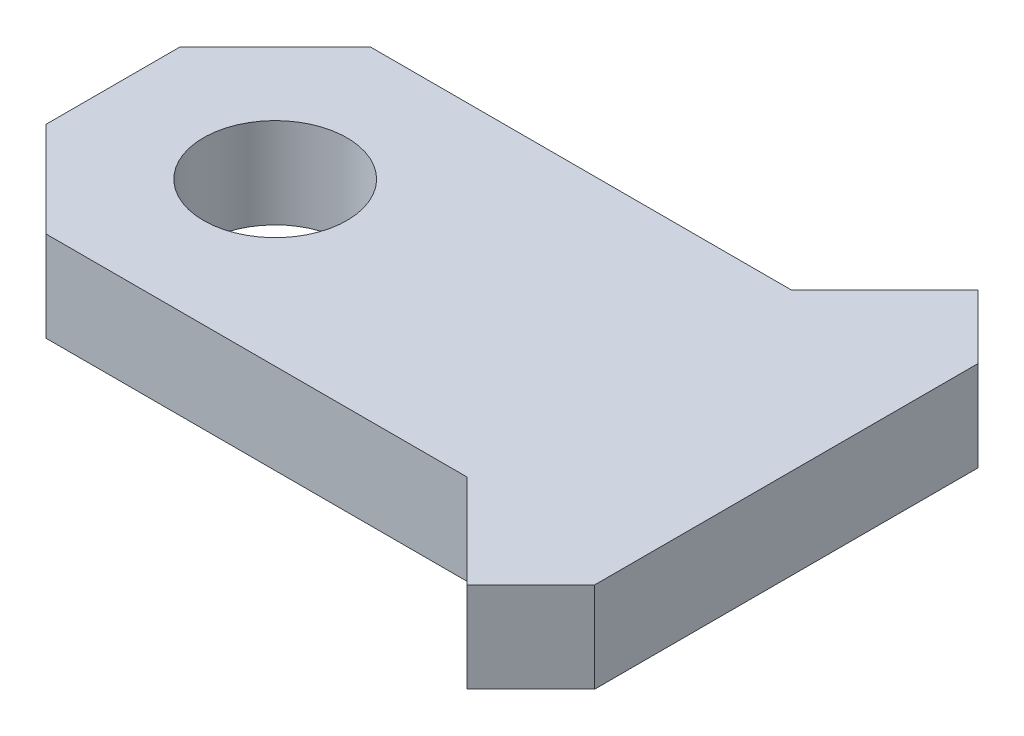
ISO-10303-21;
HEADER;
FILE_DESCRIPTION(('STEP AP214'),'2;1');
FILE_NAME('part.step','',(''),(''),'','','');
FILE_SCHEMA(('AUTOMOTIVE_DESIGN { 1 0 10303 214 1 1 1 1 }'));
ENDSEC;
DATA;
#1=APPLICATION_CONTEXT('core data for automotive mechanical design processes');
#2=APPLICATION_PROTOCOL_DEFINITION('international standard','automotive_design',2000,#1);
#3=PRODUCT_CONTEXT('',#1,'mechanical');
#4=PRODUCT('Part','Part','',(#3));
#5=PRODUCT_RELATED_PRODUCT_CATEGORY('part','',(#4));
#6=PRODUCT_DEFINITION_FORMATION('','',#4);
#7=PRODUCT_DEFINITION_CONTEXT('part definition',#1,'design');
#8=PRODUCT_DEFINITION('design','',#6,#7);
#9=PRODUCT_DEFINITION_SHAPE('','',#8);
#10=(LENGTH_UNIT() NAMED_UNIT(*) SI_UNIT(.MILLI.,.METRE.));
#11=(NAMED_UNIT(*) PLANE_ANGLE_UNIT() SI_UNIT($,.RADIAN.));
#12=(NAMED_UNIT(*) SI_UNIT($,.STERADIAN.) SOLID_ANGLE_UNIT());
#13=UNCERTAINTY_MEASURE_WITH_UNIT(LENGTH_MEASURE(1.E-05),#10,'distance_accuracy_value','');
#14=(GEOMETRIC_REPRESENTATION_CONTEXT(3) GLOBAL_UNCERTAINTY_ASSIGNED_CONTEXT((#13)) GLOBAL_UNIT_ASSIGNED_CONTEXT((#10,
#11,#12)) REPRESENTATION_CONTEXT('',''));
#15=CARTESIAN_POINT('',(0.,0.,0.));
#16=DIRECTION('',(0.,0.,1.));
#17=DIRECTION('',(1.,0.,0.));
#18=AXIS2_PLACEMENT_3D('',#15,#16,#17);
#19=CARTESIAN_POINT('',(0.,4.,0.));
#20=DIRECTION('',(0.,1.,0.));
#21=DIRECTION('',(0.,0.,1.));
#22=AXIS2_PLACEMENT_3D('',#19,#20,#21);
#23=PLANE('',#22);
#24=DIRECTION('',(-0.707106781186544,0.,0.707106781186551));
#25=VECTOR('',#24,1.);
#26=CARTESIAN_POINT('',(-2.97198231002694,4.,-7.17500000000009));
#27=LINE('',#26,#25);
#28=CARTESIAN_POINT('',(-2.97198231002694,4.,-7.17500000000009));
#29=VERTEX_POINT('',#28);
#30=CARTESIAN_POINT('',(-7.175,4.,-2.97198231002698));
#31=VERTEX_POINT('',#30);
#32=EDGE_CURVE('E165',#29,#31,#27,.T.);
#33=ORIENTED_EDGE('',*,*,#32,.T.);
#34=DIRECTION('',(0.,0.,1.));
#35=VECTOR('',#34,1.);
#36=CARTESIAN_POINT('',(-7.175,4.,-2.97198231002698));
#37=LINE('',#36,#35);
#38=CARTESIAN_POINT('',(-7.175,4.,2.97198231002698));
#39=VERTEX_POINT('',#38);
#40=EDGE_CURVE('E103',#31,#39,#37,.T.);
#41=ORIENTED_EDGE('',*,*,#40,.T.);
#42=DIRECTION('',(0.707106781186551,0.,0.707106781186544));
#43=VECTOR('',#42,1.);
#44=CARTESIAN_POINT('',(-7.175,4.,2.97198231002698));
#45=LINE('',#44,#43);
#46=CARTESIAN_POINT('',(-2.97198231002689,4.,7.17500000000004));
#47=VERTEX_POINT('',#46);
#48=EDGE_CURVE('E186',#39,#47,#45,.T.);
#49=ORIENTED_EDGE('',*,*,#48,.T.);
#50=DIRECTION('',(1.,0.,0.));
#51=VECTOR('',#50,1.);
#52=CARTESIAN_POINT('',(-2.97198231002689,4.,7.17500000000004));
#53=LINE('',#52,#51);
#54=CARTESIAN_POINT('',(15.6602813742387,4.,7.17500000000005));
#55=VERTEX_POINT('',#54);
#56=EDGE_CURVE('E205',#47,#55,#53,.T.);
#57=ORIENTED_EDGE('',*,*,#56,.T.);
#58=DIRECTION('',(0.707106781186546,0.,0.70710678118655));
#59=VECTOR('',#58,1.);
#60=CARTESIAN_POINT('',(15.6602813742387,4.,7.17500000000005));
#61=LINE('',#60,#59);
#62=CARTESIAN_POINT('',(19.7989898732234,4.,11.3137084989848));
#63=VERTEX_POINT('',#62);
#64=EDGE_CURVE('E202',#55,#63,#61,.T.);
#65=ORIENTED_EDGE('',*,*,#64,.T.);
#66=DIRECTION('',(0.707106781186551,0.,-0.707106781186544));
#67=VECTOR('',#66,1.);
#68=CARTESIAN_POINT('',(19.7989898732234,4.,11.3137084989848));
#69=LINE('',#68,#67);
#70=CARTESIAN_POINT('',(22.6274169979696,4.,8.48528137423867));
#71=VERTEX_POINT('',#70);
#72=EDGE_CURVE('E204',#63,#71,#69,.T.);
#73=ORIENTED_EDGE('',*,*,#72,.T.);
#74=DIRECTION('',(0.,0.,-1.));
#75=VECTOR('',#74,1.);
#76=CARTESIAN_POINT('',(22.6274169979696,4.,-8.4852813742386));
#77=LINE('',#76,#75);
#78=CARTESIAN_POINT('',(22.6274169979696,4.,-8.4852813742386));
#79=VERTEX_POINT('',#78);
#80=EDGE_CURVE('E128',#71,#79,#77,.T.);
#81=ORIENTED_EDGE('',*,*,#80,.T.);
#82=DIRECTION('',(-0.707106781186544,0.,-0.707106781186551));
#83=VECTOR('',#82,1.);
#84=CARTESIAN_POINT('',(22.6274169979696,4.,-8.4852813742386));
#85=LINE('',#84,#83);
#86=CARTESIAN_POINT('',(19.7989898732234,4.,-11.3137084989848));
#87=VERTEX_POINT('',#86);
#88=EDGE_CURVE('E122',#79,#87,#85,.T.);
#89=ORIENTED_EDGE('',*,*,#88,.T.);
#90=DIRECTION('',(-0.707106781186555,0.,0.70710678118654));
#91=VECTOR('',#90,1.);
#92=CARTESIAN_POINT('',(19.7989898732234,4.,-11.3137084989848));
#93=LINE('',#92,#91);
#94=CARTESIAN_POINT('',(15.6602813742386,4.,-7.17500000000009));
#95=VERTEX_POINT('',#94);
#96=EDGE_CURVE('E126',#87,#95,#93,.T.);
#97=ORIENTED_EDGE('',*,*,#96,.T.);
#98=DIRECTION('',(-1.,0.,0.));
#99=VECTOR('',#98,1.);
#100=CARTESIAN_POINT('',(15.6602813742386,4.,-7.17500000000009));
#101=LINE('',#100,#99);
#102=EDGE_CURVE('E54',#95,#29,#101,.T.);
#103=ORIENTED_EDGE('',*,*,#102,.T.);
#104=EDGE_LOOP('',(#33,#41,#49,#57,#65,#73,#81,#89,#97,#103));
#105=FACE_BOUND('',#104,.T.);
#106=CARTESIAN_POINT('',(0.,4.,0.));
#107=DIRECTION('',(0.,1.,0.));
#108=DIRECTION('',(0.,0.,1.));
#109=AXIS2_PLACEMENT_3D('',#106,#107,#108);
#110=CIRCLE('',#109,3.175);
#111=CARTESIAN_POINT('',(0.,4.,3.175));
#112=VERTEX_POINT('',#111);
#113=EDGE_CURVE('E150',#112,#112,#110,.T.);
#114=ORIENTED_EDGE('',*,*,#113,.F.);
#115=EDGE_LOOP('',(#114));
#116=FACE_BOUND('',#115,.T.);
#117=ADVANCED_FACE('F37',(#105,#116),#23,.T.);
#118=CARTESIAN_POINT('',(0.,0.,0.));
#119=DIRECTION('',(0.,1.,0.));
#120=DIRECTION('',(0.,0.,1.));
#121=AXIS2_PLACEMENT_3D('',#118,#119,#120);
#122=PLANE('',#121);
#123=DIRECTION('',(-0.707106781186544,0.,0.707106781186551));
#124=VECTOR('',#123,1.);
#125=CARTESIAN_POINT('',(-2.97198231002694,0.,-7.17500000000009));
#126=LINE('',#125,#124);
#127=CARTESIAN_POINT('',(-2.97198231002694,0.,-7.17500000000009));
#128=VERTEX_POINT('',#127);
#129=CARTESIAN_POINT('',(-7.175,0.,-2.97198231002698));
#130=VERTEX_POINT('',#129);
#131=EDGE_CURVE('E146',#128,#130,#126,.T.);
#132=ORIENTED_EDGE('',*,*,#131,.F.);
#133=DIRECTION('',(-1.,0.,0.));
#134=VECTOR('',#133,1.);
#135=CARTESIAN_POINT('',(15.6602813742386,0.,-7.17500000000009));
#136=LINE('',#135,#134);
#137=CARTESIAN_POINT('',(15.6602813742386,0.,-7.17500000000009));
#138=VERTEX_POINT('',#137);
#139=EDGE_CURVE('E95',#138,#128,#136,.T.);
#140=ORIENTED_EDGE('',*,*,#139,.F.);
#141=DIRECTION('',(-0.707106781186555,0.,0.70710678118654));
#142=VECTOR('',#141,1.);
#143=CARTESIAN_POINT('',(19.7989898732234,0.,-11.3137084989848));
#144=LINE('',#143,#142);
#145=CARTESIAN_POINT('',(19.7989898732234,0.,-11.3137084989848));
#146=VERTEX_POINT('',#145);
#147=EDGE_CURVE('E89',#146,#138,#144,.T.);
#148=ORIENTED_EDGE('',*,*,#147,.F.);
#149=DIRECTION('',(-0.707106781186544,0.,-0.707106781186551));
#150=VECTOR('',#149,1.);
#151=CARTESIAN_POINT('',(22.6274169979696,0.,-8.4852813742386));
#152=LINE('',#151,#150);
#153=CARTESIAN_POINT('',(22.6274169979696,0.,-8.4852813742386));
#154=VERTEX_POINT('',#153);
#155=EDGE_CURVE('E136',#154,#146,#152,.T.);
#156=ORIENTED_EDGE('',*,*,#155,.F.);
#157=DIRECTION('',(0.,0.,-1.));
#158=VECTOR('',#157,1.);
#159=CARTESIAN_POINT('',(22.6274169979696,0.,-8.4852813742386));
#160=LINE('',#159,#158);
#161=CARTESIAN_POINT('',(22.6274169979696,0.,8.48528137423867));
#162=VERTEX_POINT('',#161);
#163=EDGE_CURVE('E160',#162,#154,#160,.T.);
#164=ORIENTED_EDGE('',*,*,#163,.F.);
#165=DIRECTION('',(0.707106781186551,0.,-0.707106781186544));
#166=VECTOR('',#165,1.);
#167=CARTESIAN_POINT('',(19.7989898732234,0.,11.3137084989848));
#168=LINE('',#167,#166);
#169=CARTESIAN_POINT('',(19.7989898732234,0.,11.3137084989848));
#170=VERTEX_POINT('',#169);
#171=EDGE_CURVE('E158',#170,#162,#168,.T.);
#172=ORIENTED_EDGE('',*,*,#171,.F.);
#173=DIRECTION('',(0.707106781186546,0.,0.70710678118655));
#174=VECTOR('',#173,1.);
#175=CARTESIAN_POINT('',(15.6602813742387,0.,7.17500000000005));
#176=LINE('',#175,#174);
#177=CARTESIAN_POINT('',(15.6602813742387,0.,7.17500000000005));
#178=VERTEX_POINT('',#177);
#179=EDGE_CURVE('E156',#178,#170,#176,.T.);
#180=ORIENTED_EDGE('',*,*,#179,.F.);
#181=DIRECTION('',(1.,0.,0.));
#182=VECTOR('',#181,1.);
#183=CARTESIAN_POINT('',(-2.97198231002689,0.,7.17500000000004));
#184=LINE('',#183,#182);
#185=CARTESIAN_POINT('',(-2.97198231002689,0.,7.17500000000004));
#186=VERTEX_POINT('',#185);
#187=EDGE_CURVE('E154',#186,#178,#184,.T.);
#188=ORIENTED_EDGE('',*,*,#187,.F.);
#189=DIRECTION('',(0.707106781186551,0.,0.707106781186544));
#190=VECTOR('',#189,1.);
#191=CARTESIAN_POINT('',(-7.175,0.,2.97198231002698));
#192=LINE('',#191,#190);
#193=CARTESIAN_POINT('',(-7.175,0.,2.97198231002698));
#194=VERTEX_POINT('',#193);
#195=EDGE_CURVE('E152',#194,#186,#192,.T.);
#196=ORIENTED_EDGE('',*,*,#195,.F.);
#197=DIRECTION('',(0.,0.,1.));
#198=VECTOR('',#197,1.);
#199=CARTESIAN_POINT('',(-7.175,0.,-2.97198231002698));
#200=LINE('',#199,#198);
#201=EDGE_CURVE('E149',#130,#194,#200,.T.);
#202=ORIENTED_EDGE('',*,*,#201,.F.);
#203=EDGE_LOOP('',(#132,#140,#148,#156,#164,#172,#180,#188,#196,#202));
#204=FACE_BOUND('',#203,.T.);
#205=CARTESIAN_POINT('',(0.,0.,0.));
#206=DIRECTION('',(0.,1.,0.));
#207=DIRECTION('',(0.,0.,1.));
#208=AXIS2_PLACEMENT_3D('',#205,#206,#207);
#209=CIRCLE('',#208,3.175);
#210=CARTESIAN_POINT('',(0.,0.,3.175));
#211=VERTEX_POINT('',#210);
#212=EDGE_CURVE('E213',#211,#211,#209,.T.);
#213=ORIENTED_EDGE('',*,*,#212,.T.);
#214=EDGE_LOOP('',(#213));
#215=FACE_BOUND('',#214,.T.);
#216=ADVANCED_FACE('F190',(#204,#215),#122,.F.);
#217=CARTESIAN_POINT('',(-2.97198231002694,4.,-7.17500000000009));
#218=DIRECTION('',(0.707106781186551,0.,0.707106781186544));
#219=DIRECTION('',(0.707106781186544,0.,-0.707106781186551));
#220=AXIS2_PLACEMENT_3D('',#217,#218,#219);
#221=PLANE('',#220);
#222=ORIENTED_EDGE('',*,*,#131,.T.);
#223=DIRECTION('',(0.,-1.,0.));
#224=VECTOR('',#223,1.);
#225=CARTESIAN_POINT('',(-7.175,4.,-2.97198231002698));
#226=LINE('',#225,#224);
#227=EDGE_CURVE('E11',#31,#130,#226,.T.);
#228=ORIENTED_EDGE('',*,*,#227,.F.);
#229=ORIENTED_EDGE('',*,*,#32,.F.);
#230=DIRECTION('',(0.,-1.,0.));
#231=VECTOR('',#230,1.);
#232=CARTESIAN_POINT('',(-2.97198231002694,4.,-7.17500000000009));
#233=LINE('',#232,#231);
#234=EDGE_CURVE('E142',#29,#128,#233,.T.);
#235=ORIENTED_EDGE('',*,*,#234,.T.);
#236=EDGE_LOOP('',(#222,#228,#229,#235));
#237=FACE_BOUND('',#236,.T.);
#238=ADVANCED_FACE('F39',(#237),#221,.F.);
#239=CARTESIAN_POINT('',(-7.175,4.,-2.97198231002698));
#240=DIRECTION('',(1.,0.,0.));
#241=DIRECTION('',(0.,0.,-1.));
#242=AXIS2_PLACEMENT_3D('',#239,#240,#241);
#243=PLANE('',#242);
#244=ORIENTED_EDGE('',*,*,#201,.T.);
#245=DIRECTION('',(0.,-1.,0.));
#246=VECTOR('',#245,1.);
#247=CARTESIAN_POINT('',(-7.175,4.,2.97198231002698));
#248=LINE('',#247,#246);
#249=EDGE_CURVE('E46',#39,#194,#248,.T.);
#250=ORIENTED_EDGE('',*,*,#249,.F.);
#251=ORIENTED_EDGE('',*,*,#40,.F.);
#252=ORIENTED_EDGE('',*,*,#227,.T.);
#253=EDGE_LOOP('',(#244,#250,#251,#252));
#254=FACE_BOUND('',#253,.T.);
#255=ADVANCED_FACE('F249',(#254),#243,.F.);
#256=CARTESIAN_POINT('',(-7.175,4.,2.97198231002698));
#257=DIRECTION('',(0.707106781186544,0.,-0.707106781186551));
#258=DIRECTION('',(-0.707106781186551,0.,-0.707106781186544));
#259=AXIS2_PLACEMENT_3D('',#256,#257,#258);
#260=PLANE('',#259);
#261=ORIENTED_EDGE('',*,*,#195,.T.);
#262=DIRECTION('',(0.,-1.,0.));
#263=VECTOR('',#262,1.);
#264=CARTESIAN_POINT('',(-2.97198231002689,4.,7.17500000000004));
#265=LINE('',#264,#263);
#266=EDGE_CURVE('E178',#47,#186,#265,.T.);
#267=ORIENTED_EDGE('',*,*,#266,.F.);
#268=ORIENTED_EDGE('',*,*,#48,.F.);
#269=ORIENTED_EDGE('',*,*,#249,.T.);
#270=EDGE_LOOP('',(#261,#267,#268,#269));
#271=FACE_BOUND('',#270,.T.);
#272=ADVANCED_FACE('F184',(#271),#260,.F.);
#273=CARTESIAN_POINT('',(-2.97198231002689,4.,7.17500000000004));
#274=DIRECTION('',(0.,0.,-1.));
#275=DIRECTION('',(-1.,0.,0.));
#276=AXIS2_PLACEMENT_3D('',#273,#274,#275);
#277=PLANE('',#276);
#278=ORIENTED_EDGE('',*,*,#187,.T.);
#279=DIRECTION('',(0.,-1.,0.));
#280=VECTOR('',#279,1.);
#281=CARTESIAN_POINT('',(15.6602813742387,4.,7.17500000000005));
#282=LINE('',#281,#280);
#283=EDGE_CURVE('E175',#55,#178,#282,.T.);
#284=ORIENTED_EDGE('',*,*,#283,.F.);
#285=ORIENTED_EDGE('',*,*,#56,.F.);
#286=ORIENTED_EDGE('',*,*,#266,.T.);
#287=EDGE_LOOP('',(#278,#284,#285,#286));
#288=FACE_BOUND('',#287,.T.);
#289=ADVANCED_FACE('F196',(#288),#277,.F.);
#290=CARTESIAN_POINT('',(15.6602813742387,4.,7.17500000000005));
#291=DIRECTION('',(0.70710678118655,0.,-0.707106781186546));
#292=DIRECTION('',(-0.707106781186546,0.,-0.70710678118655));
#293=AXIS2_PLACEMENT_3D('',#290,#291,#292);
#294=PLANE('',#293);
#295=ORIENTED_EDGE('',*,*,#179,.T.);
#296=DIRECTION('',(0.,-1.,0.));
#297=VECTOR('',#296,1.);
#298=CARTESIAN_POINT('',(19.7989898732234,4.,11.3137084989848));
#299=LINE('',#298,#297);
#300=EDGE_CURVE('E172',#63,#170,#299,.T.);
#301=ORIENTED_EDGE('',*,*,#300,.F.);
#302=ORIENTED_EDGE('',*,*,#64,.F.);
#303=ORIENTED_EDGE('',*,*,#283,.T.);
#304=EDGE_LOOP('',(#295,#301,#302,#303));
#305=FACE_BOUND('',#304,.T.);
#306=ADVANCED_FACE('F200',(#305),#294,.F.);
#307=CARTESIAN_POINT('',(19.7989898732234,4.,11.3137084989848));
#308=DIRECTION('',(-0.707106781186544,0.,-0.707106781186551));
#309=DIRECTION('',(-0.707106781186551,0.,0.707106781186544));
#310=AXIS2_PLACEMENT_3D('',#307,#308,#309);
#311=PLANE('',#310);
#312=ORIENTED_EDGE('',*,*,#171,.T.);
#313=DIRECTION('',(0.,-1.,0.));
#314=VECTOR('',#313,1.);
#315=CARTESIAN_POINT('',(22.6274169979696,4.,8.48528137423867));
#316=LINE('',#315,#314);
#317=EDGE_CURVE('E169',#71,#162,#316,.T.);
#318=ORIENTED_EDGE('',*,*,#317,.F.);
#319=ORIENTED_EDGE('',*,*,#72,.F.);
#320=ORIENTED_EDGE('',*,*,#300,.T.);
#321=EDGE_LOOP('',(#312,#318,#319,#320));
#322=FACE_BOUND('',#321,.T.);
#323=ADVANCED_FACE('F239',(#322),#311,.F.);
#324=CARTESIAN_POINT('',(22.6274169979696,4.,-8.4852813742386));
#325=DIRECTION('',(-1.,0.,0.));
#326=DIRECTION('',(0.,0.,1.));
#327=AXIS2_PLACEMENT_3D('',#324,#325,#326);
#328=PLANE('',#327);
#329=ORIENTED_EDGE('',*,*,#163,.T.);
#330=DIRECTION('',(0.,-1.,0.));
#331=VECTOR('',#330,1.);
#332=CARTESIAN_POINT('',(22.6274169979696,4.,-8.4852813742386));
#333=LINE('',#332,#331);
#334=EDGE_CURVE('E137',#79,#154,#333,.T.);
#335=ORIENTED_EDGE('',*,*,#334,.F.);
#336=ORIENTED_EDGE('',*,*,#80,.F.);
#337=ORIENTED_EDGE('',*,*,#317,.T.);
#338=EDGE_LOOP('',(#329,#335,#336,#337));
#339=FACE_BOUND('',#338,.T.);
#340=ADVANCED_FACE('F236',(#339),#328,.F.);
#341=CARTESIAN_POINT('',(22.6274169979696,4.,-8.4852813742386));
#342=DIRECTION('',(-0.707106781186551,0.,0.707106781186544));
#343=DIRECTION('',(0.707106781186544,0.,0.707106781186551));
#344=AXIS2_PLACEMENT_3D('',#341,#342,#343);
#345=PLANE('',#344);
#346=ORIENTED_EDGE('',*,*,#155,.T.);
#347=DIRECTION('',(0.,-1.,0.));
#348=VECTOR('',#347,1.);
#349=CARTESIAN_POINT('',(19.7989898732234,4.,-11.3137084989848));
#350=LINE('',#349,#348);
#351=EDGE_CURVE('E133',#87,#146,#350,.T.);
#352=ORIENTED_EDGE('',*,*,#351,.F.);
#353=ORIENTED_EDGE('',*,*,#88,.F.);
#354=ORIENTED_EDGE('',*,*,#334,.T.);
#355=EDGE_LOOP('',(#346,#352,#353,#354));
#356=FACE_BOUND('',#355,.T.);
#357=ADVANCED_FACE('F134',(#356),#345,.F.);
#358=CARTESIAN_POINT('',(19.7989898732234,4.,-11.3137084989848));
#359=DIRECTION('',(0.70710678118654,0.,0.707106781186555));
#360=DIRECTION('',(0.707106781186555,0.,-0.70710678118654));
#361=AXIS2_PLACEMENT_3D('',#358,#359,#360);
#362=PLANE('',#361);
#363=ORIENTED_EDGE('',*,*,#147,.T.);
#364=DIRECTION('',(0.,-1.,0.));
#365=VECTOR('',#364,1.);
#366=CARTESIAN_POINT('',(15.6602813742386,4.,-7.17500000000009));
#367=LINE('',#366,#365);
#368=EDGE_CURVE('E138',#95,#138,#367,.T.);
#369=ORIENTED_EDGE('',*,*,#368,.F.);
#370=ORIENTED_EDGE('',*,*,#96,.F.);
#371=ORIENTED_EDGE('',*,*,#351,.T.);
#372=EDGE_LOOP('',(#363,#369,#370,#371));
#373=FACE_BOUND('',#372,.T.);
#374=ADVANCED_FACE('F140',(#373),#362,.F.);
#375=CARTESIAN_POINT('',(15.6602813742386,4.,-7.17500000000009));
#376=DIRECTION('',(0.,0.,1.));
#377=DIRECTION('',(1.,0.,0.));
#378=AXIS2_PLACEMENT_3D('',#375,#376,#377);
#379=PLANE('',#378);
#380=ORIENTED_EDGE('',*,*,#139,.T.);
#381=ORIENTED_EDGE('',*,*,#234,.F.);
#382=ORIENTED_EDGE('',*,*,#102,.F.);
#383=ORIENTED_EDGE('',*,*,#368,.T.);
#384=EDGE_LOOP('',(#380,#381,#382,#383));
#385=FACE_BOUND('',#384,.T.);
#386=ADVANCED_FACE('F229',(#385),#379,.F.);
#387=CARTESIAN_POINT('',(0.,4.,0.));
#388=DIRECTION('',(0.,-1.,0.));
#389=DIRECTION('',(0.,0.,-1.));
#390=AXIS2_PLACEMENT_3D('',#387,#388,#389);
#391=CYLINDRICAL_SURFACE('',#390,3.175);
#392=ORIENTED_EDGE('',*,*,#113,.T.);
#393=EDGE_LOOP('',(#392));
#394=FACE_BOUND('',#393,.T.);
#395=ORIENTED_EDGE('',*,*,#212,.F.);
#396=EDGE_LOOP('',(#395));
#397=FACE_BOUND('',#396,.T.);
#398=ADVANCED_FACE('F219',(#394,#397),#391,.F.);
#399=CLOSED_SHELL('',(#117,#216,#238,#255,#272,#289,#306,#323,#340,#357,#374,#386,#398));
#400=MANIFOLD_SOLID_BREP('B2',#399);
#401=ADVANCED_BREP_SHAPE_REPRESENTATION('',(#18,#400),#14);
#402=SHAPE_DEFINITION_REPRESENTATION(#9,#401);
ENDSEC;
END-ISO-10303-21;
